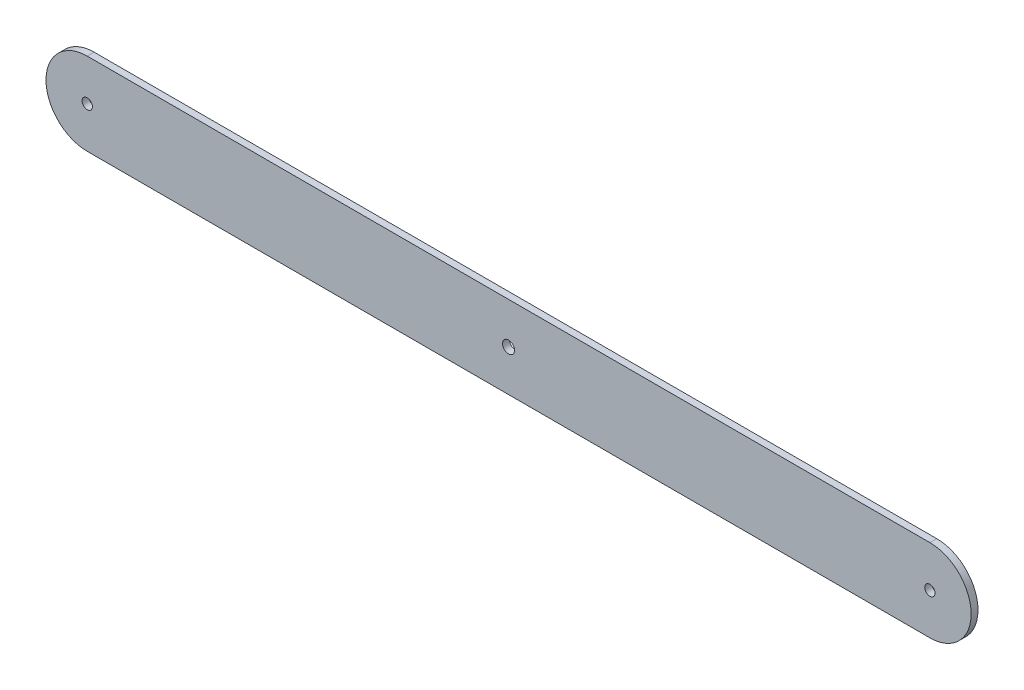
ISO-10303-21;
HEADER;
FILE_DESCRIPTION(('STEP AP214'),'2;1');
FILE_NAME('part.step','',(''),(''),'','','');
FILE_SCHEMA(('AUTOMOTIVE_DESIGN { 1 0 10303 214 1 1 1 1 }'));
ENDSEC;
DATA;
#1=APPLICATION_CONTEXT('core data for automotive mechanical design processes');
#2=APPLICATION_PROTOCOL_DEFINITION('international standard','automotive_design',2000,#1);
#3=PRODUCT_CONTEXT('',#1,'mechanical');
#4=PRODUCT('Part','Part','',(#3));
#5=PRODUCT_RELATED_PRODUCT_CATEGORY('part','',(#4));
#6=PRODUCT_DEFINITION_FORMATION('','',#4);
#7=PRODUCT_DEFINITION_CONTEXT('part definition',#1,'design');
#8=PRODUCT_DEFINITION('design','',#6,#7);
#9=PRODUCT_DEFINITION_SHAPE('','',#8);
#10=(LENGTH_UNIT() NAMED_UNIT(*) SI_UNIT(.MILLI.,.METRE.));
#11=(NAMED_UNIT(*) PLANE_ANGLE_UNIT() SI_UNIT($,.RADIAN.));
#12=(NAMED_UNIT(*) SI_UNIT($,.STERADIAN.) SOLID_ANGLE_UNIT());
#13=UNCERTAINTY_MEASURE_WITH_UNIT(LENGTH_MEASURE(1.E-05),#10,'distance_accuracy_value','');
#14=(GEOMETRIC_REPRESENTATION_CONTEXT(3) GLOBAL_UNCERTAINTY_ASSIGNED_CONTEXT((#13)) GLOBAL_UNIT_ASSIGNED_CONTEXT((#10,
#11,#12)) REPRESENTATION_CONTEXT('',''));
#15=CARTESIAN_POINT('',(0.,0.,0.));
#16=DIRECTION('',(0.,0.,1.));
#17=DIRECTION('',(1.,0.,0.));
#18=AXIS2_PLACEMENT_3D('',#15,#16,#17);
#19=CARTESIAN_POINT('',(-122.6,1.11123336822942E-13,2.));
#20=DIRECTION('',(0.,0.,1.));
#21=DIRECTION('',(1.,0.,0.));
#22=AXIS2_PLACEMENT_3D('',#19,#20,#21);
#23=PLANE('',#22);
#24=CARTESIAN_POINT('',(0.,0.,2.));
#25=DIRECTION('',(0.,0.,1.));
#26=DIRECTION('',(1.,0.,0.));
#27=AXIS2_PLACEMENT_3D('',#24,#25,#26);
#28=CIRCLE('',#27,1.75);
#29=CARTESIAN_POINT('',(1.75,0.,2.));
#30=VERTEX_POINT('',#29);
#31=EDGE_CURVE('E138',#30,#30,#28,.T.);
#32=ORIENTED_EDGE('',*,*,#31,.F.);
#33=EDGE_LOOP('',(#32));
#34=FACE_BOUND('',#33,.T.);
#35=CARTESIAN_POINT('',(-122.6,1.11123336822942E-13,2.));
#36=DIRECTION('',(0.,0.,1.));
#37=DIRECTION('',(1.,0.,0.));
#38=AXIS2_PLACEMENT_3D('',#35,#36,#37);
#39=CIRCLE('',#38,12.);
#40=CARTESIAN_POINT('',(-122.6,12.,2.));
#41=VERTEX_POINT('',#40);
#42=CARTESIAN_POINT('',(-122.6,-12.,2.));
#43=VERTEX_POINT('',#42);
#44=EDGE_CURVE('E96',#41,#43,#39,.T.);
#45=ORIENTED_EDGE('',*,*,#44,.T.);
#46=DIRECTION('',(1.,0.,0.));
#47=VECTOR('',#46,1.);
#48=CARTESIAN_POINT('',(-122.6,-12.,2.));
#49=LINE('',#48,#47);
#50=CARTESIAN_POINT('',(122.6,-11.9999999999999,2.));
#51=VERTEX_POINT('',#50);
#52=EDGE_CURVE('E91',#43,#51,#49,.T.);
#53=ORIENTED_EDGE('',*,*,#52,.T.);
#54=CARTESIAN_POINT('',(122.6,1.56165846095582E-13,2.));
#55=DIRECTION('',(0.,0.,1.));
#56=DIRECTION('',(1.,0.,0.));
#57=AXIS2_PLACEMENT_3D('',#54,#55,#56);
#58=CIRCLE('',#57,12.);
#59=CARTESIAN_POINT('',(122.6,12.0000000000001,2.));
#60=VERTEX_POINT('',#59);
#61=EDGE_CURVE('E94',#51,#60,#58,.T.);
#62=ORIENTED_EDGE('',*,*,#61,.T.);
#63=DIRECTION('',(-1.,0.,0.));
#64=VECTOR('',#63,1.);
#65=CARTESIAN_POINT('',(-122.6,12.,2.));
#66=LINE('',#65,#64);
#67=EDGE_CURVE('E61',#60,#41,#66,.T.);
#68=ORIENTED_EDGE('',*,*,#67,.T.);
#69=EDGE_LOOP('',(#45,#53,#62,#68));
#70=FACE_BOUND('',#69,.T.);
#71=CARTESIAN_POINT('',(-122.6,1.11123336822942E-13,2.));
#72=DIRECTION('',(0.,0.,1.));
#73=DIRECTION('',(1.,0.,0.));
#74=AXIS2_PLACEMENT_3D('',#71,#72,#73);
#75=CIRCLE('',#74,1.5);
#76=CARTESIAN_POINT('',(-121.1,1.11123336822942E-13,2.));
#77=VERTEX_POINT('',#76);
#78=EDGE_CURVE('E116',#77,#77,#75,.T.);
#79=ORIENTED_EDGE('',*,*,#78,.F.);
#80=EDGE_LOOP('',(#79));
#81=FACE_BOUND('',#80,.T.);
#82=CARTESIAN_POINT('',(122.6,1.56165846095582E-13,2.));
#83=DIRECTION('',(0.,0.,1.));
#84=DIRECTION('',(1.,0.,0.));
#85=AXIS2_PLACEMENT_3D('',#82,#83,#84);
#86=CIRCLE('',#85,1.5);
#87=CARTESIAN_POINT('',(124.1,1.56165846095582E-13,2.));
#88=VERTEX_POINT('',#87);
#89=EDGE_CURVE('E146',#88,#88,#86,.T.);
#90=ORIENTED_EDGE('',*,*,#89,.F.);
#91=EDGE_LOOP('',(#90));
#92=FACE_BOUND('',#91,.T.);
#93=ADVANCED_FACE('F43',(#34,#70,#81,#92),#23,.T.);
#94=CARTESIAN_POINT('',(-122.6,1.11123336822942E-13,0.));
#95=DIRECTION('',(0.,0.,1.));
#96=DIRECTION('',(1.,0.,0.));
#97=AXIS2_PLACEMENT_3D('',#94,#95,#96);
#98=PLANE('',#97);
#99=CARTESIAN_POINT('',(-122.6,1.11123336822942E-13,0.));
#100=DIRECTION('',(0.,0.,1.));
#101=DIRECTION('',(1.,0.,0.));
#102=AXIS2_PLACEMENT_3D('',#99,#100,#101);
#103=CIRCLE('',#102,12.);
#104=CARTESIAN_POINT('',(-122.6,12.,0.));
#105=VERTEX_POINT('',#104);
#106=CARTESIAN_POINT('',(-122.6,-12.,0.));
#107=VERTEX_POINT('',#106);
#108=EDGE_CURVE('E112',#105,#107,#103,.T.);
#109=ORIENTED_EDGE('',*,*,#108,.F.);
#110=DIRECTION('',(-1.,0.,0.));
#111=VECTOR('',#110,1.);
#112=CARTESIAN_POINT('',(-122.6,12.,0.));
#113=LINE('',#112,#111);
#114=CARTESIAN_POINT('',(122.6,12.0000000000001,0.));
#115=VERTEX_POINT('',#114);
#116=EDGE_CURVE('E84',#115,#105,#113,.T.);
#117=ORIENTED_EDGE('',*,*,#116,.F.);
#118=CARTESIAN_POINT('',(122.6,1.56165846095582E-13,0.));
#119=DIRECTION('',(0.,0.,1.));
#120=DIRECTION('',(1.,0.,0.));
#121=AXIS2_PLACEMENT_3D('',#118,#119,#120);
#122=CIRCLE('',#121,12.);
#123=CARTESIAN_POINT('',(122.6,-11.9999999999999,0.));
#124=VERTEX_POINT('',#123);
#125=EDGE_CURVE('E78',#124,#115,#122,.T.);
#126=ORIENTED_EDGE('',*,*,#125,.F.);
#127=DIRECTION('',(1.,0.,0.));
#128=VECTOR('',#127,1.);
#129=CARTESIAN_POINT('',(-122.6,-12.,0.));
#130=LINE('',#129,#128);
#131=EDGE_CURVE('E101',#107,#124,#130,.T.);
#132=ORIENTED_EDGE('',*,*,#131,.F.);
#133=EDGE_LOOP('',(#109,#117,#126,#132));
#134=FACE_BOUND('',#133,.T.);
#135=CARTESIAN_POINT('',(-122.6,1.11123336822942E-13,0.));
#136=DIRECTION('',(0.,0.,1.));
#137=DIRECTION('',(1.,0.,0.));
#138=AXIS2_PLACEMENT_3D('',#135,#136,#137);
#139=CIRCLE('',#138,1.5);
#140=CARTESIAN_POINT('',(-121.1,1.11123336822942E-13,0.));
#141=VERTEX_POINT('',#140);
#142=EDGE_CURVE('E134',#141,#141,#139,.T.);
#143=ORIENTED_EDGE('',*,*,#142,.T.);
#144=EDGE_LOOP('',(#143));
#145=FACE_BOUND('',#144,.T.);
#146=CARTESIAN_POINT('',(0.,0.,0.));
#147=DIRECTION('',(0.,0.,1.));
#148=DIRECTION('',(1.,0.,0.));
#149=AXIS2_PLACEMENT_3D('',#146,#147,#148);
#150=CIRCLE('',#149,1.75);
#151=CARTESIAN_POINT('',(1.75,0.,0.));
#152=VERTEX_POINT('',#151);
#153=EDGE_CURVE('E142',#152,#152,#150,.T.);
#154=ORIENTED_EDGE('',*,*,#153,.T.);
#155=EDGE_LOOP('',(#154));
#156=FACE_BOUND('',#155,.T.);
#157=CARTESIAN_POINT('',(122.6,1.56165846095582E-13,0.));
#158=DIRECTION('',(0.,0.,1.));
#159=DIRECTION('',(1.,0.,0.));
#160=AXIS2_PLACEMENT_3D('',#157,#158,#159);
#161=CIRCLE('',#160,1.5);
#162=CARTESIAN_POINT('',(124.1,1.56165846095582E-13,0.));
#163=VERTEX_POINT('',#162);
#164=EDGE_CURVE('E150',#163,#163,#161,.T.);
#165=ORIENTED_EDGE('',*,*,#164,.T.);
#166=EDGE_LOOP('',(#165));
#167=FACE_BOUND('',#166,.T.);
#168=ADVANCED_FACE('F129',(#134,#145,#156,#167),#98,.F.);
#169=CARTESIAN_POINT('',(-122.6,1.11123336822942E-13,2.));
#170=DIRECTION('',(0.,0.,-1.));
#171=DIRECTION('',(-1.,0.,0.));
#172=AXIS2_PLACEMENT_3D('',#169,#170,#171);
#173=CYLINDRICAL_SURFACE('',#172,12.);
#174=ORIENTED_EDGE('',*,*,#108,.T.);
#175=DIRECTION('',(0.,0.,-1.));
#176=VECTOR('',#175,1.);
#177=CARTESIAN_POINT('',(-122.6,-12.,2.));
#178=LINE('',#177,#176);
#179=EDGE_CURVE('E11',#43,#107,#178,.T.);
#180=ORIENTED_EDGE('',*,*,#179,.F.);
#181=ORIENTED_EDGE('',*,*,#44,.F.);
#182=DIRECTION('',(0.,0.,-1.));
#183=VECTOR('',#182,1.);
#184=CARTESIAN_POINT('',(-122.6,12.,2.));
#185=LINE('',#184,#183);
#186=EDGE_CURVE('E108',#41,#105,#185,.T.);
#187=ORIENTED_EDGE('',*,*,#186,.T.);
#188=EDGE_LOOP('',(#174,#180,#181,#187));
#189=FACE_BOUND('',#188,.T.);
#190=ADVANCED_FACE('F45',(#189),#173,.T.);
#191=CARTESIAN_POINT('',(-122.6,-12.,2.));
#192=DIRECTION('',(0.,1.,0.));
#193=DIRECTION('',(-1.,0.,0.));
#194=AXIS2_PLACEMENT_3D('',#191,#192,#193);
#195=PLANE('',#194);
#196=ORIENTED_EDGE('',*,*,#131,.T.);
#197=DIRECTION('',(0.,0.,-1.));
#198=VECTOR('',#197,1.);
#199=CARTESIAN_POINT('',(122.6,-11.9999999999999,2.));
#200=LINE('',#199,#198);
#201=EDGE_CURVE('E53',#51,#124,#200,.T.);
#202=ORIENTED_EDGE('',*,*,#201,.F.);
#203=ORIENTED_EDGE('',*,*,#52,.F.);
#204=ORIENTED_EDGE('',*,*,#179,.T.);
#205=EDGE_LOOP('',(#196,#202,#203,#204));
#206=FACE_BOUND('',#205,.T.);
#207=ADVANCED_FACE('F100',(#206),#195,.F.);
#208=CARTESIAN_POINT('',(122.6,1.56165846095582E-13,2.));
#209=DIRECTION('',(0.,0.,-1.));
#210=DIRECTION('',(-1.,0.,0.));
#211=AXIS2_PLACEMENT_3D('',#208,#209,#210);
#212=CYLINDRICAL_SURFACE('',#211,12.);
#213=ORIENTED_EDGE('',*,*,#125,.T.);
#214=DIRECTION('',(0.,0.,-1.));
#215=VECTOR('',#214,1.);
#216=CARTESIAN_POINT('',(122.6,12.0000000000001,2.));
#217=LINE('',#216,#215);
#218=EDGE_CURVE('E103',#60,#115,#217,.T.);
#219=ORIENTED_EDGE('',*,*,#218,.F.);
#220=ORIENTED_EDGE('',*,*,#61,.F.);
#221=ORIENTED_EDGE('',*,*,#201,.T.);
#222=EDGE_LOOP('',(#213,#219,#220,#221));
#223=FACE_BOUND('',#222,.T.);
#224=ADVANCED_FACE('F104',(#223),#212,.T.);
#225=CARTESIAN_POINT('',(-122.6,12.,2.));
#226=DIRECTION('',(0.,-1.,0.));
#227=DIRECTION('',(1.,0.,0.));
#228=AXIS2_PLACEMENT_3D('',#225,#226,#227);
#229=PLANE('',#228);
#230=ORIENTED_EDGE('',*,*,#116,.T.);
#231=ORIENTED_EDGE('',*,*,#186,.F.);
#232=ORIENTED_EDGE('',*,*,#67,.F.);
#233=ORIENTED_EDGE('',*,*,#218,.T.);
#234=EDGE_LOOP('',(#230,#231,#232,#233));
#235=FACE_BOUND('',#234,.T.);
#236=ADVANCED_FACE('F126',(#235),#229,.F.);
#237=CARTESIAN_POINT('',(-122.6,1.11123336822942E-13,2.));
#238=DIRECTION('',(0.,0.,-1.));
#239=DIRECTION('',(-1.,0.,0.));
#240=AXIS2_PLACEMENT_3D('',#237,#238,#239);
#241=CYLINDRICAL_SURFACE('',#240,1.5);
#242=ORIENTED_EDGE('',*,*,#78,.T.);
#243=EDGE_LOOP('',(#242));
#244=FACE_BOUND('',#243,.T.);
#245=ORIENTED_EDGE('',*,*,#142,.F.);
#246=EDGE_LOOP('',(#245));
#247=FACE_BOUND('',#246,.T.);
#248=ADVANCED_FACE('F170',(#244,#247),#241,.F.);
#249=CARTESIAN_POINT('',(0.,0.,2.));
#250=DIRECTION('',(0.,0.,-1.));
#251=DIRECTION('',(-1.,0.,0.));
#252=AXIS2_PLACEMENT_3D('',#249,#250,#251);
#253=CYLINDRICAL_SURFACE('',#252,1.75);
#254=ORIENTED_EDGE('',*,*,#31,.T.);
#255=EDGE_LOOP('',(#254));
#256=FACE_BOUND('',#255,.T.);
#257=ORIENTED_EDGE('',*,*,#153,.F.);
#258=EDGE_LOOP('',(#257));
#259=FACE_BOUND('',#258,.T.);
#260=ADVANCED_FACE('F224',(#256,#259),#253,.F.);
#261=CARTESIAN_POINT('',(122.6,1.56165846095582E-13,2.));
#262=DIRECTION('',(0.,0.,-1.));
#263=DIRECTION('',(-1.,0.,0.));
#264=AXIS2_PLACEMENT_3D('',#261,#262,#263);
#265=CYLINDRICAL_SURFACE('',#264,1.5);
#266=ORIENTED_EDGE('',*,*,#89,.T.);
#267=EDGE_LOOP('',(#266));
#268=FACE_BOUND('',#267,.T.);
#269=ORIENTED_EDGE('',*,*,#164,.F.);
#270=EDGE_LOOP('',(#269));
#271=FACE_BOUND('',#270,.T.);
#272=ADVANCED_FACE('F158',(#268,#271),#265,.F.);
#273=CLOSED_SHELL('',(#93,#168,#190,#207,#224,#236,#248,#260,#272));
#274=MANIFOLD_SOLID_BREP('B2',#273);
#275=ADVANCED_BREP_SHAPE_REPRESENTATION('',(#18,#274),#14);
#276=SHAPE_DEFINITION_REPRESENTATION(#9,#275);
ENDSEC;
END-ISO-10303-21;
